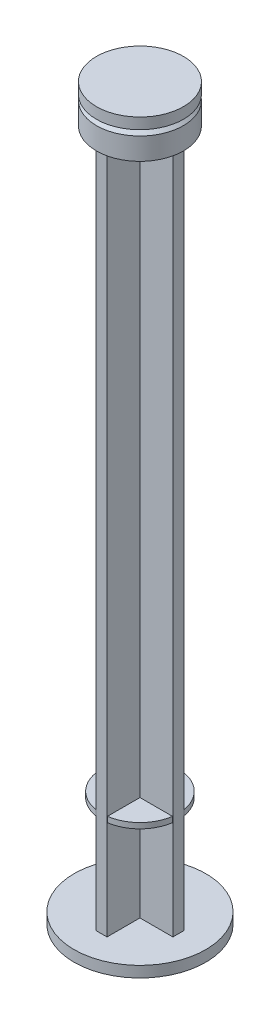
ISO-10303-21;
HEADER;
FILE_DESCRIPTION(('STEP AP214'),'2;1');
FILE_NAME('part.step','',(''),(''),'','','');
FILE_SCHEMA(('AUTOMOTIVE_DESIGN { 1 0 10303 214 1 1 1 1 }'));
ENDSEC;
DATA;
#1=APPLICATION_CONTEXT('core data for automotive mechanical design processes');
#2=APPLICATION_PROTOCOL_DEFINITION('international standard','automotive_design',2000,#1);
#3=PRODUCT_CONTEXT('',#1,'mechanical');
#4=PRODUCT('Part','Part','',(#3));
#5=PRODUCT_RELATED_PRODUCT_CATEGORY('part','',(#4));
#6=PRODUCT_DEFINITION_FORMATION('','',#4);
#7=PRODUCT_DEFINITION_CONTEXT('part definition',#1,'design');
#8=PRODUCT_DEFINITION('design','',#6,#7);
#9=PRODUCT_DEFINITION_SHAPE('','',#8);
#10=(LENGTH_UNIT() NAMED_UNIT(*) SI_UNIT(.MILLI.,.METRE.));
#11=(NAMED_UNIT(*) PLANE_ANGLE_UNIT() SI_UNIT($,.RADIAN.));
#12=(NAMED_UNIT(*) SI_UNIT($,.STERADIAN.) SOLID_ANGLE_UNIT());
#13=UNCERTAINTY_MEASURE_WITH_UNIT(LENGTH_MEASURE(1.E-05),#10,'distance_accuracy_value','');
#14=(GEOMETRIC_REPRESENTATION_CONTEXT(3) GLOBAL_UNCERTAINTY_ASSIGNED_CONTEXT((#13)) GLOBAL_UNIT_ASSIGNED_CONTEXT((#10,
#11,#12)) REPRESENTATION_CONTEXT('',''));
#15=CARTESIAN_POINT('',(0.,0.,0.));
#16=DIRECTION('',(0.,0.,1.));
#17=DIRECTION('',(1.,0.,0.));
#18=AXIS2_PLACEMENT_3D('',#15,#16,#17);
#19=CARTESIAN_POINT('',(0.,1.,0.));
#20=DIRECTION('',(0.,1.,0.));
#21=DIRECTION('',(0.,0.,1.));
#22=AXIS2_PLACEMENT_3D('',#19,#20,#21);
#23=PLANE('',#22);
#24=CARTESIAN_POINT('',(0.,1.,0.));
#25=DIRECTION('',(0.,1.,0.));
#26=DIRECTION('',(0.,0.,1.));
#27=AXIS2_PLACEMENT_3D('',#24,#25,#26);
#28=CIRCLE('',#27,6.);
#29=CARTESIAN_POINT('',(0.,1.,6.));
#30=VERTEX_POINT('',#29);
#31=EDGE_CURVE('E262',#30,#30,#28,.T.);
#32=ORIENTED_EDGE('',*,*,#31,.T.);
#33=EDGE_LOOP('',(#32));
#34=FACE_BOUND('',#33,.T.);
#35=DIRECTION('',(-1.,0.,0.));
#36=VECTOR('',#35,1.);
#37=CARTESIAN_POINT('',(3.5,1.,-0.5));
#38=LINE('',#37,#36);
#39=CARTESIAN_POINT('',(3.5,1.,-0.5));
#40=VERTEX_POINT('',#39);
#41=CARTESIAN_POINT('',(0.5,1.,-0.5));
#42=VERTEX_POINT('',#41);
#43=EDGE_CURVE('E446',#40,#42,#38,.T.);
#44=ORIENTED_EDGE('',*,*,#43,.F.);
#45=DIRECTION('',(0.,0.,-1.));
#46=VECTOR('',#45,1.);
#47=CARTESIAN_POINT('',(3.5,1.,-0.5));
#48=LINE('',#47,#46);
#49=CARTESIAN_POINT('',(3.5,1.,0.5));
#50=VERTEX_POINT('',#49);
#51=EDGE_CURVE('E444',#50,#40,#48,.T.);
#52=ORIENTED_EDGE('',*,*,#51,.F.);
#53=DIRECTION('',(1.,0.,0.));
#54=VECTOR('',#53,1.);
#55=CARTESIAN_POINT('',(3.5,1.,0.5));
#56=LINE('',#55,#54);
#57=CARTESIAN_POINT('',(0.5,1.,0.5));
#58=VERTEX_POINT('',#57);
#59=EDGE_CURVE('E206',#58,#50,#56,.T.);
#60=ORIENTED_EDGE('',*,*,#59,.F.);
#61=DIRECTION('',(0.,0.,-1.));
#62=VECTOR('',#61,1.);
#63=CARTESIAN_POINT('',(0.5,1.,0.5));
#64=LINE('',#63,#62);
#65=CARTESIAN_POINT('',(0.5,1.,3.5));
#66=VERTEX_POINT('',#65);
#67=EDGE_CURVE('E467',#66,#58,#64,.T.);
#68=ORIENTED_EDGE('',*,*,#67,.F.);
#69=DIRECTION('',(1.,0.,0.));
#70=VECTOR('',#69,1.);
#71=CARTESIAN_POINT('',(0.5,1.,3.5));
#72=LINE('',#71,#70);
#73=CARTESIAN_POINT('',(-0.5,1.,3.5));
#74=VERTEX_POINT('',#73);
#75=EDGE_CURVE('E465',#74,#66,#72,.T.);
#76=ORIENTED_EDGE('',*,*,#75,.F.);
#77=DIRECTION('',(0.,0.,1.));
#78=VECTOR('',#77,1.);
#79=CARTESIAN_POINT('',(-0.5,1.,0.5));
#80=LINE('',#79,#78);
#81=CARTESIAN_POINT('',(-0.5,1.,0.5));
#82=VERTEX_POINT('',#81);
#83=EDGE_CURVE('E463',#82,#74,#80,.T.);
#84=ORIENTED_EDGE('',*,*,#83,.F.);
#85=DIRECTION('',(1.,0.,0.));
#86=VECTOR('',#85,1.);
#87=CARTESIAN_POINT('',(-0.5,1.,0.5));
#88=LINE('',#87,#86);
#89=CARTESIAN_POINT('',(-3.5,1.,0.5));
#90=VERTEX_POINT('',#89);
#91=EDGE_CURVE('E460',#90,#82,#88,.T.);
#92=ORIENTED_EDGE('',*,*,#91,.F.);
#93=DIRECTION('',(0.,0.,1.));
#94=VECTOR('',#93,1.);
#95=CARTESIAN_POINT('',(-3.5,1.,-0.5));
#96=LINE('',#95,#94);
#97=CARTESIAN_POINT('',(-3.5,1.,-0.5));
#98=VERTEX_POINT('',#97);
#99=EDGE_CURVE('E458',#98,#90,#96,.T.);
#100=ORIENTED_EDGE('',*,*,#99,.F.);
#101=DIRECTION('',(-1.,0.,0.));
#102=VECTOR('',#101,1.);
#103=CARTESIAN_POINT('',(-0.5,1.,-0.5));
#104=LINE('',#103,#102);
#105=CARTESIAN_POINT('',(-0.5,1.,-0.5));
#106=VERTEX_POINT('',#105);
#107=EDGE_CURVE('E456',#106,#98,#104,.T.);
#108=ORIENTED_EDGE('',*,*,#107,.F.);
#109=DIRECTION('',(0.,0.,1.));
#110=VECTOR('',#109,1.);
#111=CARTESIAN_POINT('',(-0.5,1.,-3.5));
#112=LINE('',#111,#110);
#113=CARTESIAN_POINT('',(-0.5,1.,-3.5));
#114=VERTEX_POINT('',#113);
#115=EDGE_CURVE('E453',#114,#106,#112,.T.);
#116=ORIENTED_EDGE('',*,*,#115,.F.);
#117=DIRECTION('',(-1.,0.,0.));
#118=VECTOR('',#117,1.);
#119=CARTESIAN_POINT('',(0.5,1.,-3.5));
#120=LINE('',#119,#118);
#121=CARTESIAN_POINT('',(0.5,1.,-3.5));
#122=VERTEX_POINT('',#121);
#123=EDGE_CURVE('E451',#122,#114,#120,.T.);
#124=ORIENTED_EDGE('',*,*,#123,.F.);
#125=DIRECTION('',(0.,0.,-1.));
#126=VECTOR('',#125,1.);
#127=CARTESIAN_POINT('',(0.5,1.,-3.5));
#128=LINE('',#127,#126);
#129=EDGE_CURVE('E449',#42,#122,#128,.T.);
#130=ORIENTED_EDGE('',*,*,#129,.F.);
#131=EDGE_LOOP('',(#44,#52,#60,#68,#76,#84,#92,#100,#108,#116,#124,#130));
#132=FACE_BOUND('',#131,.T.);
#133=ADVANCED_FACE('F34',(#34,#132),#23,.T.);
#134=CARTESIAN_POINT('',(0.,1.,0.));
#135=DIRECTION('',(0.,-1.,0.));
#136=DIRECTION('',(0.,0.,-1.));
#137=AXIS2_PLACEMENT_3D('',#134,#135,#136);
#138=CYLINDRICAL_SURFACE('',#137,6.);
#139=ORIENTED_EDGE('',*,*,#31,.F.);
#140=EDGE_LOOP('',(#139));
#141=FACE_BOUND('',#140,.T.);
#142=CARTESIAN_POINT('',(0.,0.,0.));
#143=DIRECTION('',(0.,1.,0.));
#144=DIRECTION('',(0.,0.,1.));
#145=AXIS2_PLACEMENT_3D('',#142,#143,#144);
#146=CIRCLE('',#145,6.);
#147=CARTESIAN_POINT('',(0.,0.,6.));
#148=VERTEX_POINT('',#147);
#149=EDGE_CURVE('E259',#148,#148,#146,.T.);
#150=ORIENTED_EDGE('',*,*,#149,.T.);
#151=EDGE_LOOP('',(#150));
#152=FACE_BOUND('',#151,.T.);
#153=ADVANCED_FACE('F36',(#141,#152),#138,.T.);
#154=CARTESIAN_POINT('',(0.,0.,0.));
#155=DIRECTION('',(0.,1.,0.));
#156=DIRECTION('',(0.,0.,1.));
#157=AXIS2_PLACEMENT_3D('',#154,#155,#156);
#158=PLANE('',#157);
#159=ORIENTED_EDGE('',*,*,#149,.F.);
#160=EDGE_LOOP('',(#159));
#161=FACE_BOUND('',#160,.T.);
#162=ADVANCED_FACE('F300',(#161),#158,.F.);
#163=CARTESIAN_POINT('',(3.5,63.,-0.5));
#164=DIRECTION('',(-1.,0.,0.));
#165=DIRECTION('',(0.,0.,1.));
#166=AXIS2_PLACEMENT_3D('',#163,#164,#165);
#167=PLANE('',#166);
#168=ORIENTED_EDGE('',*,*,#51,.T.);
#169=DIRECTION('',(0.,-1.,0.));
#170=VECTOR('',#169,1.);
#171=CARTESIAN_POINT('',(3.5,63.,-0.5));
#172=LINE('',#171,#170);
#173=CARTESIAN_POINT('',(3.5,63.,-0.5));
#174=VERTEX_POINT('',#173);
#175=EDGE_CURVE('E201',#174,#40,#172,.T.);
#176=ORIENTED_EDGE('',*,*,#175,.F.);
#177=DIRECTION('',(0.,0.,-1.));
#178=VECTOR('',#177,1.);
#179=CARTESIAN_POINT('',(3.5,63.,-0.5));
#180=LINE('',#179,#178);
#181=CARTESIAN_POINT('',(3.5,63.,0.5));
#182=VERTEX_POINT('',#181);
#183=EDGE_CURVE('E195',#182,#174,#180,.T.);
#184=ORIENTED_EDGE('',*,*,#183,.F.);
#185=DIRECTION('',(0.,-1.,0.));
#186=VECTOR('',#185,1.);
#187=CARTESIAN_POINT('',(3.5,63.,0.5));
#188=LINE('',#187,#186);
#189=EDGE_CURVE('E199',#182,#50,#188,.T.);
#190=ORIENTED_EDGE('',*,*,#189,.T.);
#191=EDGE_LOOP('',(#168,#176,#184,#190));
#192=FACE_BOUND('',#191,.T.);
#193=ADVANCED_FACE('F198',(#192),#167,.F.);
#194=CARTESIAN_POINT('',(3.5,63.,-0.5));
#195=DIRECTION('',(0.,0.,1.));
#196=DIRECTION('',(1.,0.,0.));
#197=AXIS2_PLACEMENT_3D('',#194,#195,#196);
#198=PLANE('',#197);
#199=DIRECTION('',(0.,-1.,0.));
#200=VECTOR('',#199,1.);
#201=CARTESIAN_POINT('',(3.46410161513775,10.5,-0.5));
#202=LINE('',#201,#200);
#203=CARTESIAN_POINT('',(3.46410161513775,10.5,-0.5));
#204=VERTEX_POINT('',#203);
#205=CARTESIAN_POINT('',(3.46410161513775,10.,-0.5));
#206=VERTEX_POINT('',#205);
#207=EDGE_CURVE('E49',#204,#206,#202,.T.);
#208=ORIENTED_EDGE('',*,*,#207,.F.);
#209=DIRECTION('',(-1.,0.,0.));
#210=VECTOR('',#209,1.);
#211=CARTESIAN_POINT('',(3.5,10.5,-0.5));
#212=LINE('',#211,#210);
#213=CARTESIAN_POINT('',(0.5,10.5,-0.5));
#214=VERTEX_POINT('',#213);
#215=EDGE_CURVE('E423',#204,#214,#212,.T.);
#216=ORIENTED_EDGE('',*,*,#215,.T.);
#217=DIRECTION('',(0.,-1.,0.));
#218=VECTOR('',#217,1.);
#219=CARTESIAN_POINT('',(0.5,63.,-0.5));
#220=LINE('',#219,#218);
#221=CARTESIAN_POINT('',(0.5,63.,-0.5));
#222=VERTEX_POINT('',#221);
#223=EDGE_CURVE('E255',#222,#214,#220,.T.);
#224=ORIENTED_EDGE('',*,*,#223,.F.);
#225=DIRECTION('',(-1.,0.,0.));
#226=VECTOR('',#225,1.);
#227=CARTESIAN_POINT('',(3.5,63.,-0.5));
#228=LINE('',#227,#226);
#229=EDGE_CURVE('E205',#174,#222,#228,.T.);
#230=ORIENTED_EDGE('',*,*,#229,.F.);
#231=ORIENTED_EDGE('',*,*,#175,.T.);
#232=ORIENTED_EDGE('',*,*,#43,.T.);
#233=CARTESIAN_POINT('',(0.5,10.,-0.5));
#234=VERTEX_POINT('',#233);
#235=EDGE_CURVE('E254',#234,#42,#220,.T.);
#236=ORIENTED_EDGE('',*,*,#235,.F.);
#237=DIRECTION('',(-1.,0.,0.));
#238=VECTOR('',#237,1.);
#239=CARTESIAN_POINT('',(3.5,10.,-0.5));
#240=LINE('',#239,#238);
#241=EDGE_CURVE('E54',#206,#234,#240,.T.);
#242=ORIENTED_EDGE('',*,*,#241,.F.);
#243=EDGE_LOOP('',(#208,#216,#224,#230,#231,#232,#236,#242));
#244=FACE_BOUND('',#243,.T.);
#245=ADVANCED_FACE('F309',(#244),#198,.F.);
#246=CARTESIAN_POINT('',(0.5,63.,-3.5));
#247=DIRECTION('',(-1.,0.,0.));
#248=DIRECTION('',(0.,0.,1.));
#249=AXIS2_PLACEMENT_3D('',#246,#247,#248);
#250=PLANE('',#249);
#251=ORIENTED_EDGE('',*,*,#223,.T.);
#252=DIRECTION('',(0.,0.,-1.));
#253=VECTOR('',#252,1.);
#254=CARTESIAN_POINT('',(0.5,10.5,-3.5));
#255=LINE('',#254,#253);
#256=CARTESIAN_POINT('',(0.5,10.5,-3.46410161513775));
#257=VERTEX_POINT('',#256);
#258=EDGE_CURVE('E421',#214,#257,#255,.T.);
#259=ORIENTED_EDGE('',*,*,#258,.T.);
#260=DIRECTION('',(0.,-1.,0.));
#261=VECTOR('',#260,1.);
#262=CARTESIAN_POINT('',(0.5,10.5,-3.46410161513775));
#263=LINE('',#262,#261);
#264=CARTESIAN_POINT('',(0.5,10.,-3.46410161513775));
#265=VERTEX_POINT('',#264);
#266=EDGE_CURVE('E440',#265,#257,#263,.F.);
#267=ORIENTED_EDGE('',*,*,#266,.F.);
#268=DIRECTION('',(0.,0.,-1.));
#269=VECTOR('',#268,1.);
#270=CARTESIAN_POINT('',(0.5,10.,-3.5));
#271=LINE('',#270,#269);
#272=EDGE_CURVE('E407',#234,#265,#271,.T.);
#273=ORIENTED_EDGE('',*,*,#272,.F.);
#274=ORIENTED_EDGE('',*,*,#235,.T.);
#275=ORIENTED_EDGE('',*,*,#129,.T.);
#276=DIRECTION('',(0.,-1.,0.));
#277=VECTOR('',#276,1.);
#278=CARTESIAN_POINT('',(0.5,63.,-3.5));
#279=LINE('',#278,#277);
#280=CARTESIAN_POINT('',(0.5,63.,-3.5));
#281=VERTEX_POINT('',#280);
#282=EDGE_CURVE('E251',#281,#122,#279,.T.);
#283=ORIENTED_EDGE('',*,*,#282,.F.);
#284=DIRECTION('',(0.,0.,-1.));
#285=VECTOR('',#284,1.);
#286=CARTESIAN_POINT('',(0.5,63.,-3.5));
#287=LINE('',#286,#285);
#288=EDGE_CURVE('E472',#222,#281,#287,.T.);
#289=ORIENTED_EDGE('',*,*,#288,.F.);
#290=EDGE_LOOP('',(#251,#259,#267,#273,#274,#275,#283,#289));
#291=FACE_BOUND('',#290,.T.);
#292=ADVANCED_FACE('F312',(#291),#250,.F.);
#293=CARTESIAN_POINT('',(0.5,63.,-3.5));
#294=DIRECTION('',(0.,0.,1.));
#295=DIRECTION('',(1.,0.,0.));
#296=AXIS2_PLACEMENT_3D('',#293,#294,#295);
#297=PLANE('',#296);
#298=ORIENTED_EDGE('',*,*,#123,.T.);
#299=DIRECTION('',(0.,-1.,0.));
#300=VECTOR('',#299,1.);
#301=CARTESIAN_POINT('',(-0.5,63.,-3.5));
#302=LINE('',#301,#300);
#303=CARTESIAN_POINT('',(-0.5,63.,-3.5));
#304=VERTEX_POINT('',#303);
#305=EDGE_CURVE('E248',#304,#114,#302,.T.);
#306=ORIENTED_EDGE('',*,*,#305,.F.);
#307=DIRECTION('',(-1.,0.,0.));
#308=VECTOR('',#307,1.);
#309=CARTESIAN_POINT('',(0.5,63.,-3.5));
#310=LINE('',#309,#308);
#311=EDGE_CURVE('E475',#281,#304,#310,.T.);
#312=ORIENTED_EDGE('',*,*,#311,.F.);
#313=ORIENTED_EDGE('',*,*,#282,.T.);
#314=EDGE_LOOP('',(#298,#306,#312,#313));
#315=FACE_BOUND('',#314,.T.);
#316=ADVANCED_FACE('F315',(#315),#297,.F.);
#317=CARTESIAN_POINT('',(-0.5,63.,-3.5));
#318=DIRECTION('',(1.,0.,0.));
#319=DIRECTION('',(0.,0.,-1.));
#320=AXIS2_PLACEMENT_3D('',#317,#318,#319);
#321=PLANE('',#320);
#322=DIRECTION('',(0.,-1.,0.));
#323=VECTOR('',#322,1.);
#324=CARTESIAN_POINT('',(-0.5,10.5,-3.46410161513775));
#325=LINE('',#324,#323);
#326=CARTESIAN_POINT('',(-0.5,10.5,-3.46410161513775));
#327=VERTEX_POINT('',#326);
#328=CARTESIAN_POINT('',(-0.5,10.,-3.46410161513775));
#329=VERTEX_POINT('',#328);
#330=EDGE_CURVE('E437',#327,#329,#325,.T.);
#331=ORIENTED_EDGE('',*,*,#330,.F.);
#332=DIRECTION('',(0.,0.,1.));
#333=VECTOR('',#332,1.);
#334=CARTESIAN_POINT('',(-0.5,10.5,-3.5));
#335=LINE('',#334,#333);
#336=CARTESIAN_POINT('',(-0.5,10.5,-0.5));
#337=VERTEX_POINT('',#336);
#338=EDGE_CURVE('E419',#327,#337,#335,.T.);
#339=ORIENTED_EDGE('',*,*,#338,.T.);
#340=DIRECTION('',(0.,-1.,0.));
#341=VECTOR('',#340,1.);
#342=CARTESIAN_POINT('',(-0.5,63.,-0.5));
#343=LINE('',#342,#341);
#344=CARTESIAN_POINT('',(-0.5,63.,-0.5));
#345=VERTEX_POINT('',#344);
#346=EDGE_CURVE('E245',#345,#337,#343,.T.);
#347=ORIENTED_EDGE('',*,*,#346,.F.);
#348=DIRECTION('',(0.,0.,1.));
#349=VECTOR('',#348,1.);
#350=CARTESIAN_POINT('',(-0.5,63.,-3.5));
#351=LINE('',#350,#349);
#352=EDGE_CURVE('E478',#304,#345,#351,.T.);
#353=ORIENTED_EDGE('',*,*,#352,.F.);
#354=ORIENTED_EDGE('',*,*,#305,.T.);
#355=ORIENTED_EDGE('',*,*,#115,.T.);
#356=CARTESIAN_POINT('',(-0.5,10.,-0.5));
#357=VERTEX_POINT('',#356);
#358=EDGE_CURVE('E244',#357,#106,#343,.T.);
#359=ORIENTED_EDGE('',*,*,#358,.F.);
#360=DIRECTION('',(0.,0.,1.));
#361=VECTOR('',#360,1.);
#362=CARTESIAN_POINT('',(-0.5,10.,-3.5));
#363=LINE('',#362,#361);
#364=EDGE_CURVE('E404',#329,#357,#363,.T.);
#365=ORIENTED_EDGE('',*,*,#364,.F.);
#366=EDGE_LOOP('',(#331,#339,#347,#353,#354,#355,#359,#365));
#367=FACE_BOUND('',#366,.T.);
#368=ADVANCED_FACE('F319',(#367),#321,.F.);
#369=CARTESIAN_POINT('',(-0.5,63.,-0.5));
#370=DIRECTION('',(0.,0.,1.));
#371=DIRECTION('',(1.,0.,0.));
#372=AXIS2_PLACEMENT_3D('',#369,#370,#371);
#373=PLANE('',#372);
#374=ORIENTED_EDGE('',*,*,#346,.T.);
#375=DIRECTION('',(-1.,0.,0.));
#376=VECTOR('',#375,1.);
#377=CARTESIAN_POINT('',(-0.5,10.5,-0.5));
#378=LINE('',#377,#376);
#379=CARTESIAN_POINT('',(-3.46410161513775,10.5,-0.5));
#380=VERTEX_POINT('',#379);
#381=EDGE_CURVE('E417',#337,#380,#378,.T.);
#382=ORIENTED_EDGE('',*,*,#381,.T.);
#383=DIRECTION('',(0.,-1.,0.));
#384=VECTOR('',#383,1.);
#385=CARTESIAN_POINT('',(-3.46410161513775,10.5,-0.5));
#386=LINE('',#385,#384);
#387=CARTESIAN_POINT('',(-3.46410161513775,10.,-0.5));
#388=VERTEX_POINT('',#387);
#389=EDGE_CURVE('E434',#388,#380,#386,.F.);
#390=ORIENTED_EDGE('',*,*,#389,.F.);
#391=DIRECTION('',(-1.,0.,0.));
#392=VECTOR('',#391,1.);
#393=CARTESIAN_POINT('',(-0.5,10.,-0.5));
#394=LINE('',#393,#392);
#395=EDGE_CURVE('E401',#357,#388,#394,.T.);
#396=ORIENTED_EDGE('',*,*,#395,.F.);
#397=ORIENTED_EDGE('',*,*,#358,.T.);
#398=ORIENTED_EDGE('',*,*,#107,.T.);
#399=DIRECTION('',(0.,-1.,0.));
#400=VECTOR('',#399,1.);
#401=CARTESIAN_POINT('',(-3.5,63.,-0.5));
#402=LINE('',#401,#400);
#403=CARTESIAN_POINT('',(-3.5,63.,-0.5));
#404=VERTEX_POINT('',#403);
#405=EDGE_CURVE('E241',#404,#98,#402,.T.);
#406=ORIENTED_EDGE('',*,*,#405,.F.);
#407=DIRECTION('',(-1.,0.,0.));
#408=VECTOR('',#407,1.);
#409=CARTESIAN_POINT('',(-0.5,63.,-0.5));
#410=LINE('',#409,#408);
#411=EDGE_CURVE('E481',#345,#404,#410,.T.);
#412=ORIENTED_EDGE('',*,*,#411,.F.);
#413=EDGE_LOOP('',(#374,#382,#390,#396,#397,#398,#406,#412));
#414=FACE_BOUND('',#413,.T.);
#415=ADVANCED_FACE('F323',(#414),#373,.F.);
#416=CARTESIAN_POINT('',(-3.5,63.,-0.5));
#417=DIRECTION('',(1.,0.,0.));
#418=DIRECTION('',(0.,0.,-1.));
#419=AXIS2_PLACEMENT_3D('',#416,#417,#418);
#420=PLANE('',#419);
#421=ORIENTED_EDGE('',*,*,#99,.T.);
#422=DIRECTION('',(0.,-1.,0.));
#423=VECTOR('',#422,1.);
#424=CARTESIAN_POINT('',(-3.5,63.,0.5));
#425=LINE('',#424,#423);
#426=CARTESIAN_POINT('',(-3.5,63.,0.5));
#427=VERTEX_POINT('',#426);
#428=EDGE_CURVE('E238',#427,#90,#425,.T.);
#429=ORIENTED_EDGE('',*,*,#428,.F.);
#430=DIRECTION('',(0.,0.,1.));
#431=VECTOR('',#430,1.);
#432=CARTESIAN_POINT('',(-3.5,63.,-0.5));
#433=LINE('',#432,#431);
#434=EDGE_CURVE('E484',#404,#427,#433,.T.);
#435=ORIENTED_EDGE('',*,*,#434,.F.);
#436=ORIENTED_EDGE('',*,*,#405,.T.);
#437=EDGE_LOOP('',(#421,#429,#435,#436));
#438=FACE_BOUND('',#437,.T.);
#439=ADVANCED_FACE('F327',(#438),#420,.F.);
#440=CARTESIAN_POINT('',(-0.5,63.,0.5));
#441=DIRECTION('',(0.,0.,-1.));
#442=DIRECTION('',(-1.,0.,0.));
#443=AXIS2_PLACEMENT_3D('',#440,#441,#442);
#444=PLANE('',#443);
#445=DIRECTION('',(0.,-1.,0.));
#446=VECTOR('',#445,1.);
#447=CARTESIAN_POINT('',(-3.46410161513775,10.5,0.5));
#448=LINE('',#447,#446);
#449=CARTESIAN_POINT('',(-3.46410161513775,10.5,0.5));
#450=VERTEX_POINT('',#449);
#451=CARTESIAN_POINT('',(-3.46410161513775,10.,0.5));
#452=VERTEX_POINT('',#451);
#453=EDGE_CURVE('E431',#450,#452,#448,.T.);
#454=ORIENTED_EDGE('',*,*,#453,.F.);
#455=DIRECTION('',(1.,0.,0.));
#456=VECTOR('',#455,1.);
#457=CARTESIAN_POINT('',(-0.5,10.5,0.5));
#458=LINE('',#457,#456);
#459=CARTESIAN_POINT('',(-0.5,10.5,0.5));
#460=VERTEX_POINT('',#459);
#461=EDGE_CURVE('E415',#450,#460,#458,.T.);
#462=ORIENTED_EDGE('',*,*,#461,.T.);
#463=DIRECTION('',(0.,-1.,0.));
#464=VECTOR('',#463,1.);
#465=CARTESIAN_POINT('',(-0.5,63.,0.5));
#466=LINE('',#465,#464);
#467=CARTESIAN_POINT('',(-0.5,63.,0.5));
#468=VERTEX_POINT('',#467);
#469=EDGE_CURVE('E235',#468,#460,#466,.T.);
#470=ORIENTED_EDGE('',*,*,#469,.F.);
#471=DIRECTION('',(1.,0.,0.));
#472=VECTOR('',#471,1.);
#473=CARTESIAN_POINT('',(-0.5,63.,0.5));
#474=LINE('',#473,#472);
#475=EDGE_CURVE('E487',#427,#468,#474,.T.);
#476=ORIENTED_EDGE('',*,*,#475,.F.);
#477=ORIENTED_EDGE('',*,*,#428,.T.);
#478=ORIENTED_EDGE('',*,*,#91,.T.);
#479=CARTESIAN_POINT('',(-0.5,10.,0.5));
#480=VERTEX_POINT('',#479);
#481=EDGE_CURVE('E234',#480,#82,#466,.T.);
#482=ORIENTED_EDGE('',*,*,#481,.F.);
#483=DIRECTION('',(1.,0.,0.));
#484=VECTOR('',#483,1.);
#485=CARTESIAN_POINT('',(-0.5,10.,0.5));
#486=LINE('',#485,#484);
#487=EDGE_CURVE('E398',#452,#480,#486,.T.);
#488=ORIENTED_EDGE('',*,*,#487,.F.);
#489=EDGE_LOOP('',(#454,#462,#470,#476,#477,#478,#482,#488));
#490=FACE_BOUND('',#489,.T.);
#491=ADVANCED_FACE('F331',(#490),#444,.F.);
#492=CARTESIAN_POINT('',(-0.5,63.,0.5));
#493=DIRECTION('',(1.,0.,0.));
#494=DIRECTION('',(0.,0.,-1.));
#495=AXIS2_PLACEMENT_3D('',#492,#493,#494);
#496=PLANE('',#495);
#497=ORIENTED_EDGE('',*,*,#469,.T.);
#498=DIRECTION('',(0.,0.,1.));
#499=VECTOR('',#498,1.);
#500=CARTESIAN_POINT('',(-0.5,10.5,0.5));
#501=LINE('',#500,#499);
#502=CARTESIAN_POINT('',(-0.5,10.5,3.46410161513775));
#503=VERTEX_POINT('',#502);
#504=EDGE_CURVE('E413',#460,#503,#501,.T.);
#505=ORIENTED_EDGE('',*,*,#504,.T.);
#506=DIRECTION('',(0.,-1.,0.));
#507=VECTOR('',#506,1.);
#508=CARTESIAN_POINT('',(-0.5,10.5,3.46410161513775));
#509=LINE('',#508,#507);
#510=CARTESIAN_POINT('',(-0.5,10.,3.46410161513775));
#511=VERTEX_POINT('',#510);
#512=EDGE_CURVE('E428',#511,#503,#509,.F.);
#513=ORIENTED_EDGE('',*,*,#512,.F.);
#514=DIRECTION('',(0.,0.,1.));
#515=VECTOR('',#514,1.);
#516=CARTESIAN_POINT('',(-0.5,10.,0.5));
#517=LINE('',#516,#515);
#518=EDGE_CURVE('E395',#480,#511,#517,.T.);
#519=ORIENTED_EDGE('',*,*,#518,.F.);
#520=ORIENTED_EDGE('',*,*,#481,.T.);
#521=ORIENTED_EDGE('',*,*,#83,.T.);
#522=DIRECTION('',(0.,-1.,0.));
#523=VECTOR('',#522,1.);
#524=CARTESIAN_POINT('',(-0.5,63.,3.5));
#525=LINE('',#524,#523);
#526=CARTESIAN_POINT('',(-0.5,63.,3.5));
#527=VERTEX_POINT('',#526);
#528=EDGE_CURVE('E231',#527,#74,#525,.T.);
#529=ORIENTED_EDGE('',*,*,#528,.F.);
#530=DIRECTION('',(0.,0.,1.));
#531=VECTOR('',#530,1.);
#532=CARTESIAN_POINT('',(-0.5,63.,0.5));
#533=LINE('',#532,#531);
#534=EDGE_CURVE('E490',#468,#527,#533,.T.);
#535=ORIENTED_EDGE('',*,*,#534,.F.);
#536=EDGE_LOOP('',(#497,#505,#513,#519,#520,#521,#529,#535));
#537=FACE_BOUND('',#536,.T.);
#538=ADVANCED_FACE('F335',(#537),#496,.F.);
#539=CARTESIAN_POINT('',(0.5,63.,3.5));
#540=DIRECTION('',(0.,0.,-1.));
#541=DIRECTION('',(-1.,0.,0.));
#542=AXIS2_PLACEMENT_3D('',#539,#540,#541);
#543=PLANE('',#542);
#544=ORIENTED_EDGE('',*,*,#75,.T.);
#545=DIRECTION('',(0.,-1.,0.));
#546=VECTOR('',#545,1.);
#547=CARTESIAN_POINT('',(0.5,63.,3.5));
#548=LINE('',#547,#546);
#549=CARTESIAN_POINT('',(0.5,63.,3.5));
#550=VERTEX_POINT('',#549);
#551=EDGE_CURVE('E228',#550,#66,#548,.T.);
#552=ORIENTED_EDGE('',*,*,#551,.F.);
#553=DIRECTION('',(1.,0.,0.));
#554=VECTOR('',#553,1.);
#555=CARTESIAN_POINT('',(0.5,63.,3.5));
#556=LINE('',#555,#554);
#557=EDGE_CURVE('E222',#527,#550,#556,.T.);
#558=ORIENTED_EDGE('',*,*,#557,.F.);
#559=ORIENTED_EDGE('',*,*,#528,.T.);
#560=EDGE_LOOP('',(#544,#552,#558,#559));
#561=FACE_BOUND('',#560,.T.);
#562=ADVANCED_FACE('F339',(#561),#543,.F.);
#563=CARTESIAN_POINT('',(0.5,63.,0.5));
#564=DIRECTION('',(-1.,0.,0.));
#565=DIRECTION('',(0.,0.,1.));
#566=AXIS2_PLACEMENT_3D('',#563,#564,#565);
#567=PLANE('',#566);
#568=DIRECTION('',(0.,-1.,0.));
#569=VECTOR('',#568,1.);
#570=CARTESIAN_POINT('',(0.5,10.5,3.46410161513775));
#571=LINE('',#570,#569);
#572=CARTESIAN_POINT('',(0.5,10.5,3.46410161513775));
#573=VERTEX_POINT('',#572);
#574=CARTESIAN_POINT('',(0.5,10.,3.46410161513775));
#575=VERTEX_POINT('',#574);
#576=EDGE_CURVE('E425',#573,#575,#571,.T.);
#577=ORIENTED_EDGE('',*,*,#576,.F.);
#578=DIRECTION('',(0.,0.,-1.));
#579=VECTOR('',#578,1.);
#580=CARTESIAN_POINT('',(0.5,10.5,0.5));
#581=LINE('',#580,#579);
#582=CARTESIAN_POINT('',(0.5,10.5,0.5));
#583=VERTEX_POINT('',#582);
#584=EDGE_CURVE('E411',#573,#583,#581,.T.);
#585=ORIENTED_EDGE('',*,*,#584,.T.);
#586=DIRECTION('',(0.,-1.,0.));
#587=VECTOR('',#586,1.);
#588=CARTESIAN_POINT('',(0.5,63.,0.5));
#589=LINE('',#588,#587);
#590=CARTESIAN_POINT('',(0.5,63.,0.5));
#591=VERTEX_POINT('',#590);
#592=EDGE_CURVE('E226',#591,#583,#589,.T.);
#593=ORIENTED_EDGE('',*,*,#592,.F.);
#594=DIRECTION('',(0.,0.,-1.));
#595=VECTOR('',#594,1.);
#596=CARTESIAN_POINT('',(0.5,63.,0.5));
#597=LINE('',#596,#595);
#598=EDGE_CURVE('E220',#550,#591,#597,.T.);
#599=ORIENTED_EDGE('',*,*,#598,.F.);
#600=ORIENTED_EDGE('',*,*,#551,.T.);
#601=ORIENTED_EDGE('',*,*,#67,.T.);
#602=CARTESIAN_POINT('',(0.5,10.,0.5));
#603=VERTEX_POINT('',#602);
#604=EDGE_CURVE('E215',#603,#58,#589,.T.);
#605=ORIENTED_EDGE('',*,*,#604,.F.);
#606=DIRECTION('',(0.,0.,-1.));
#607=VECTOR('',#606,1.);
#608=CARTESIAN_POINT('',(0.5,10.,0.5));
#609=LINE('',#608,#607);
#610=EDGE_CURVE('E392',#575,#603,#609,.T.);
#611=ORIENTED_EDGE('',*,*,#610,.F.);
#612=EDGE_LOOP('',(#577,#585,#593,#599,#600,#601,#605,#611));
#613=FACE_BOUND('',#612,.T.);
#614=ADVANCED_FACE('F343',(#613),#567,.F.);
#615=CARTESIAN_POINT('',(3.5,63.,0.5));
#616=DIRECTION('',(0.,0.,-1.));
#617=DIRECTION('',(-1.,0.,0.));
#618=AXIS2_PLACEMENT_3D('',#615,#616,#617);
#619=PLANE('',#618);
#620=ORIENTED_EDGE('',*,*,#592,.T.);
#621=DIRECTION('',(1.,0.,0.));
#622=VECTOR('',#621,1.);
#623=CARTESIAN_POINT('',(3.5,10.5,0.5));
#624=LINE('',#623,#622);
#625=CARTESIAN_POINT('',(3.46410161513775,10.5,0.5));
#626=VERTEX_POINT('',#625);
#627=EDGE_CURVE('E271',#583,#626,#624,.T.);
#628=ORIENTED_EDGE('',*,*,#627,.T.);
#629=DIRECTION('',(0.,-1.,0.));
#630=VECTOR('',#629,1.);
#631=CARTESIAN_POINT('',(3.46410161513775,10.5,0.5));
#632=LINE('',#631,#630);
#633=CARTESIAN_POINT('',(3.46410161513775,10.,0.5));
#634=VERTEX_POINT('',#633);
#635=EDGE_CURVE('E268',#634,#626,#632,.F.);
#636=ORIENTED_EDGE('',*,*,#635,.F.);
#637=DIRECTION('',(1.,0.,0.));
#638=VECTOR('',#637,1.);
#639=CARTESIAN_POINT('',(3.5,10.,0.5));
#640=LINE('',#639,#638);
#641=EDGE_CURVE('E265',#603,#634,#640,.T.);
#642=ORIENTED_EDGE('',*,*,#641,.F.);
#643=ORIENTED_EDGE('',*,*,#604,.T.);
#644=ORIENTED_EDGE('',*,*,#59,.T.);
#645=ORIENTED_EDGE('',*,*,#189,.F.);
#646=DIRECTION('',(1.,0.,0.));
#647=VECTOR('',#646,1.);
#648=CARTESIAN_POINT('',(3.5,63.,0.5));
#649=LINE('',#648,#647);
#650=EDGE_CURVE('E212',#591,#182,#649,.T.);
#651=ORIENTED_EDGE('',*,*,#650,.F.);
#652=EDGE_LOOP('',(#620,#628,#636,#642,#643,#644,#645,#651));
#653=FACE_BOUND('',#652,.T.);
#654=ADVANCED_FACE('F211',(#653),#619,.F.);
#655=CARTESIAN_POINT('',(0.,10.,0.));
#656=DIRECTION('',(0.,1.,0.));
#657=DIRECTION('',(0.,0.,1.));
#658=AXIS2_PLACEMENT_3D('',#655,#656,#657);
#659=PLANE('',#658);
#660=CARTESIAN_POINT('',(0.,10.,0.));
#661=DIRECTION('',(0.,1.,0.));
#662=DIRECTION('',(0.,0.,1.));
#663=AXIS2_PLACEMENT_3D('',#660,#661,#662);
#664=CIRCLE('',#663,3.5);
#665=EDGE_CURVE('E381',#575,#634,#664,.T.);
#666=ORIENTED_EDGE('',*,*,#665,.F.);
#667=ORIENTED_EDGE('',*,*,#610,.T.);
#668=ORIENTED_EDGE('',*,*,#641,.T.);
#669=EDGE_LOOP('',(#666,#667,#668));
#670=FACE_BOUND('',#669,.T.);
#671=ADVANCED_FACE('F350',(#670),#659,.F.);
#672=CARTESIAN_POINT('',(0.,10.5,0.));
#673=DIRECTION('',(0.,1.,0.));
#674=DIRECTION('',(0.,0.,1.));
#675=AXIS2_PLACEMENT_3D('',#672,#673,#674);
#676=PLANE('',#675);
#677=ORIENTED_EDGE('',*,*,#584,.F.);
#678=CARTESIAN_POINT('',(0.,10.5,0.));
#679=DIRECTION('',(0.,1.,0.));
#680=DIRECTION('',(0.,0.,1.));
#681=AXIS2_PLACEMENT_3D('',#678,#679,#680);
#682=CIRCLE('',#681,3.5);
#683=EDGE_CURVE('E391',#573,#626,#682,.T.);
#684=ORIENTED_EDGE('',*,*,#683,.T.);
#685=ORIENTED_EDGE('',*,*,#627,.F.);
#686=EDGE_LOOP('',(#677,#684,#685));
#687=FACE_BOUND('',#686,.T.);
#688=ADVANCED_FACE('F363',(#687),#676,.T.);
#689=CARTESIAN_POINT('',(0.,10.5,0.));
#690=DIRECTION('',(0.,-1.,0.));
#691=DIRECTION('',(0.,0.,-1.));
#692=AXIS2_PLACEMENT_3D('',#689,#690,#691);
#693=CYLINDRICAL_SURFACE('',#692,3.5);
#694=ORIENTED_EDGE('',*,*,#683,.F.);
#695=ORIENTED_EDGE('',*,*,#576,.T.);
#696=ORIENTED_EDGE('',*,*,#665,.T.);
#697=ORIENTED_EDGE('',*,*,#635,.T.);
#698=EDGE_LOOP('',(#694,#695,#696,#697));
#699=FACE_BOUND('',#698,.T.);
#700=ADVANCED_FACE('F357',(#699),#693,.T.);
#701=EDGE_CURVE('E375',#452,#511,#664,.T.);
#702=ORIENTED_EDGE('',*,*,#701,.F.);
#703=ORIENTED_EDGE('',*,*,#487,.T.);
#704=ORIENTED_EDGE('',*,*,#518,.T.);
#705=EDGE_LOOP('',(#702,#703,#704));
#706=FACE_BOUND('',#705,.T.);
#707=ADVANCED_FACE('F539',(#706),#659,.F.);
#708=ORIENTED_EDGE('',*,*,#461,.F.);
#709=EDGE_CURVE('E387',#450,#503,#682,.T.);
#710=ORIENTED_EDGE('',*,*,#709,.T.);
#711=ORIENTED_EDGE('',*,*,#504,.F.);
#712=EDGE_LOOP('',(#708,#710,#711));
#713=FACE_BOUND('',#712,.T.);
#714=ADVANCED_FACE('F545',(#713),#676,.T.);
#715=ORIENTED_EDGE('',*,*,#709,.F.);
#716=ORIENTED_EDGE('',*,*,#453,.T.);
#717=ORIENTED_EDGE('',*,*,#701,.T.);
#718=ORIENTED_EDGE('',*,*,#512,.T.);
#719=EDGE_LOOP('',(#715,#716,#717,#718));
#720=FACE_BOUND('',#719,.T.);
#721=ADVANCED_FACE('F540',(#720),#693,.T.);
#722=EDGE_CURVE('E379',#329,#388,#664,.T.);
#723=ORIENTED_EDGE('',*,*,#722,.F.);
#724=ORIENTED_EDGE('',*,*,#364,.T.);
#725=ORIENTED_EDGE('',*,*,#395,.T.);
#726=EDGE_LOOP('',(#723,#724,#725));
#727=FACE_BOUND('',#726,.T.);
#728=ADVANCED_FACE('F366',(#727),#659,.F.);
#729=ORIENTED_EDGE('',*,*,#338,.F.);
#730=EDGE_CURVE('E390',#327,#380,#682,.T.);
#731=ORIENTED_EDGE('',*,*,#730,.T.);
#732=ORIENTED_EDGE('',*,*,#381,.F.);
#733=EDGE_LOOP('',(#729,#731,#732));
#734=FACE_BOUND('',#733,.T.);
#735=ADVANCED_FACE('F362',(#734),#676,.T.);
#736=ORIENTED_EDGE('',*,*,#730,.F.);
#737=ORIENTED_EDGE('',*,*,#330,.T.);
#738=ORIENTED_EDGE('',*,*,#722,.T.);
#739=ORIENTED_EDGE('',*,*,#389,.T.);
#740=EDGE_LOOP('',(#736,#737,#738,#739));
#741=FACE_BOUND('',#740,.T.);
#742=ADVANCED_FACE('F355',(#741),#693,.T.);
#743=EDGE_CURVE('E502',#204,#257,#682,.T.);
#744=ORIENTED_EDGE('',*,*,#743,.F.);
#745=ORIENTED_EDGE('',*,*,#207,.T.);
#746=EDGE_CURVE('E535',#206,#265,#664,.T.);
#747=ORIENTED_EDGE('',*,*,#746,.T.);
#748=ORIENTED_EDGE('',*,*,#266,.T.);
#749=EDGE_LOOP('',(#744,#745,#747,#748));
#750=FACE_BOUND('',#749,.T.);
#751=ADVANCED_FACE('F351',(#750),#693,.T.);
#752=ORIENTED_EDGE('',*,*,#215,.F.);
#753=ORIENTED_EDGE('',*,*,#743,.T.);
#754=ORIENTED_EDGE('',*,*,#258,.F.);
#755=EDGE_LOOP('',(#752,#753,#754));
#756=FACE_BOUND('',#755,.T.);
#757=ADVANCED_FACE('F354',(#756),#676,.T.);
#758=ORIENTED_EDGE('',*,*,#746,.F.);
#759=ORIENTED_EDGE('',*,*,#241,.T.);
#760=ORIENTED_EDGE('',*,*,#272,.T.);
#761=EDGE_LOOP('',(#758,#759,#760));
#762=FACE_BOUND('',#761,.T.);
#763=ADVANCED_FACE('F360',(#762),#659,.F.);
#764=CARTESIAN_POINT('',(0.,63.,0.));
#765=DIRECTION('',(0.,1.,0.));
#766=DIRECTION('',(0.,0.,1.));
#767=AXIS2_PLACEMENT_3D('',#764,#765,#766);
#768=PLANE('',#767);
#769=CARTESIAN_POINT('',(0.,63.,0.));
#770=DIRECTION('',(0.,1.,0.));
#771=DIRECTION('',(0.,0.,1.));
#772=AXIS2_PLACEMENT_3D('',#769,#770,#771);
#773=CIRCLE('',#772,3.96253122500599);
#774=CARTESIAN_POINT('',(0.,63.,3.96253122500599));
#775=VERTEX_POINT('',#774);
#776=EDGE_CURVE('E373',#775,#775,#773,.T.);
#777=ORIENTED_EDGE('',*,*,#776,.F.);
#778=EDGE_LOOP('',(#777));
#779=FACE_BOUND('',#778,.T.);
#780=ORIENTED_EDGE('',*,*,#650,.T.);
#781=ORIENTED_EDGE('',*,*,#183,.T.);
#782=ORIENTED_EDGE('',*,*,#229,.T.);
#783=ORIENTED_EDGE('',*,*,#288,.T.);
#784=ORIENTED_EDGE('',*,*,#311,.T.);
#785=ORIENTED_EDGE('',*,*,#352,.T.);
#786=ORIENTED_EDGE('',*,*,#411,.T.);
#787=ORIENTED_EDGE('',*,*,#434,.T.);
#788=ORIENTED_EDGE('',*,*,#475,.T.);
#789=ORIENTED_EDGE('',*,*,#534,.T.);
#790=ORIENTED_EDGE('',*,*,#557,.T.);
#791=ORIENTED_EDGE('',*,*,#598,.T.);
#792=EDGE_LOOP('',(#780,#781,#782,#783,#784,#785,#786,#787,#788,#789,#790,#791));
#793=FACE_BOUND('',#792,.T.);
#794=ADVANCED_FACE('F217',(#779,#793),#768,.F.);
#795=CARTESIAN_POINT('',(0.,65.5,0.));
#796=DIRECTION('',(0.,-1.,0.));
#797=DIRECTION('',(0.,0.,-1.));
#798=AXIS2_PLACEMENT_3D('',#795,#796,#797);
#799=CYLINDRICAL_SURFACE('',#798,3.96253122500599);
#800=CARTESIAN_POINT('',(0.,65.,0.));
#801=DIRECTION('',(0.,1.,0.));
#802=DIRECTION('',(0.,0.,1.));
#803=AXIS2_PLACEMENT_3D('',#800,#801,#802);
#804=CIRCLE('',#803,3.96253122500599);
#805=CARTESIAN_POINT('',(0.,65.,3.96253122500599));
#806=VERTEX_POINT('',#805);
#807=EDGE_CURVE('E11',#806,#806,#804,.F.);
#808=ORIENTED_EDGE('',*,*,#807,.T.);
#809=EDGE_LOOP('',(#808));
#810=FACE_BOUND('',#809,.T.);
#811=ORIENTED_EDGE('',*,*,#776,.T.);
#812=EDGE_LOOP('',(#811));
#813=FACE_BOUND('',#812,.T.);
#814=ADVANCED_FACE('F281',(#810,#813),#799,.T.);
#815=CARTESIAN_POINT('',(0.,65.5,0.));
#816=DIRECTION('',(0.,-1.,0.));
#817=DIRECTION('',(0.,0.,-1.));
#818=AXIS2_PLACEMENT_3D('',#815,#816,#817);
#819=CONICAL_SURFACE('',#818,3.46253122500598,0.78539816339745);
#820=ORIENTED_EDGE('',*,*,#807,.F.);
#821=EDGE_LOOP('',(#820));
#822=FACE_BOUND('',#821,.T.);
#823=CARTESIAN_POINT('',(0.,65.5,0.));
#824=DIRECTION('',(0.,1.,0.));
#825=DIRECTION('',(0.,0.,1.));
#826=AXIS2_PLACEMENT_3D('',#823,#824,#825);
#827=CIRCLE('',#826,3.46253122500598);
#828=CARTESIAN_POINT('',(0.,65.5,3.46253122500598));
#829=VERTEX_POINT('',#828);
#830=EDGE_CURVE('E42',#829,#829,#827,.T.);
#831=ORIENTED_EDGE('',*,*,#830,.F.);
#832=EDGE_LOOP('',(#831));
#833=FACE_BOUND('',#832,.T.);
#834=ADVANCED_FACE('F278',(#822,#833),#819,.T.);
#835=CARTESIAN_POINT('',(-1.09379482061316E-12,66.5,3.67369992098914E-12));
#836=DIRECTION('',(0.,-1.,0.));
#837=DIRECTION('',(0.,0.,-1.));
#838=AXIS2_PLACEMENT_3D('',#835,#836,#837);
#839=CYLINDRICAL_SURFACE('',#838,3.96497508014876);
#840=CARTESIAN_POINT('',(-1.09379482061316E-12,66.5,3.67369992098914E-12));
#841=DIRECTION('',(0.,1.,0.));
#842=DIRECTION('',(0.,0.,1.));
#843=AXIS2_PLACEMENT_3D('',#840,#841,#842);
#844=CIRCLE('',#843,3.96497508014876);
#845=CARTESIAN_POINT('',(-1.09379482061316E-12,66.5,3.96497508015243));
#846=VERTEX_POINT('',#845);
#847=EDGE_CURVE('E376',#846,#846,#844,.T.);
#848=ORIENTED_EDGE('',*,*,#847,.F.);
#849=EDGE_LOOP('',(#848));
#850=FACE_BOUND('',#849,.T.);
#851=CARTESIAN_POINT('',(-1.09379482061316E-12,65.5,3.67369992098914E-12));
#852=DIRECTION('',(0.,1.,0.));
#853=DIRECTION('',(0.,0.,1.));
#854=AXIS2_PLACEMENT_3D('',#851,#852,#853);
#855=CIRCLE('',#854,3.96497508014876);
#856=CARTESIAN_POINT('',(-1.09379482061316E-12,65.5,3.96497508015243));
#857=VERTEX_POINT('',#856);
#858=EDGE_CURVE('E383',#857,#857,#855,.T.);
#859=ORIENTED_EDGE('',*,*,#858,.T.);
#860=EDGE_LOOP('',(#859));
#861=FACE_BOUND('',#860,.T.);
#862=ADVANCED_FACE('F280',(#850,#861),#839,.T.);
#863=CARTESIAN_POINT('',(-1.09379482061316E-12,66.5,3.67369992098914E-12));
#864=DIRECTION('',(0.,1.,0.));
#865=DIRECTION('',(0.,0.,1.));
#866=AXIS2_PLACEMENT_3D('',#863,#864,#865);
#867=PLANE('',#866);
#868=ORIENTED_EDGE('',*,*,#847,.T.);
#869=EDGE_LOOP('',(#868));
#870=FACE_BOUND('',#869,.T.);
#871=ADVANCED_FACE('F288',(#870),#867,.T.);
#872=CARTESIAN_POINT('',(-1.09379482061316E-12,65.5,3.67369992098914E-12));
#873=DIRECTION('',(0.,1.,0.));
#874=DIRECTION('',(0.,0.,1.));
#875=AXIS2_PLACEMENT_3D('',#872,#873,#874);
#876=PLANE('',#875);
#877=ORIENTED_EDGE('',*,*,#830,.T.);
#878=EDGE_LOOP('',(#877));
#879=FACE_BOUND('',#878,.T.);
#880=ORIENTED_EDGE('',*,*,#858,.F.);
#881=EDGE_LOOP('',(#880));
#882=FACE_BOUND('',#881,.T.);
#883=ADVANCED_FACE('F275',(#879,#882),#876,.F.);
#884=CLOSED_SHELL('',(#133,#153,#162,#193,#245,#292,#316,#368,#415,#439,#491,#538,#562,#614,
#654,#671,#688,#700,#707,#714,#721,#728,#735,#742,#751,#757,#763,#794,#814,#834,#862,#871,#883));
#885=MANIFOLD_SOLID_BREP('B2',#884);
#886=ADVANCED_BREP_SHAPE_REPRESENTATION('',(#18,#885),#14);
#887=SHAPE_DEFINITION_REPRESENTATION(#9,#886);
ENDSEC;
END-ISO-10303-21;
